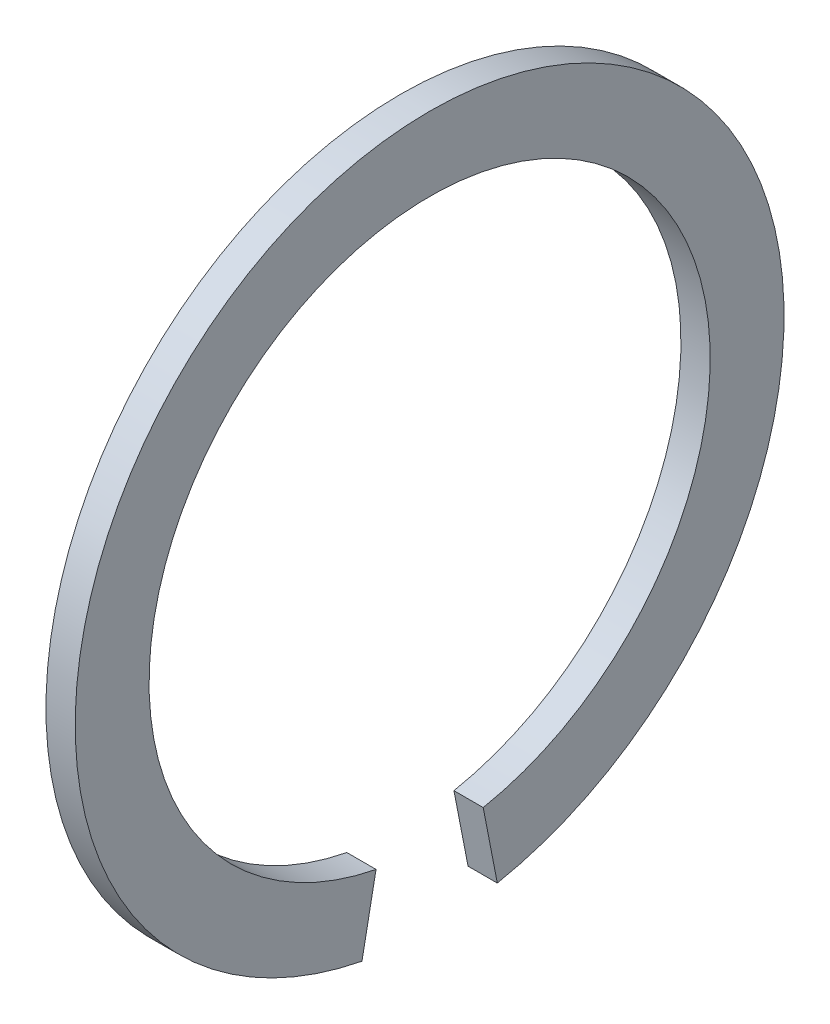
ISO-10303-21;
HEADER;
FILE_DESCRIPTION(('STEP AP214'),'2;1');
FILE_NAME('part.step','',(''),(''),'','','');
FILE_SCHEMA(('AUTOMOTIVE_DESIGN { 1 0 10303 214 1 1 1 1 }'));
ENDSEC;
DATA;
#1=APPLICATION_CONTEXT('core data for automotive mechanical design processes');
#2=APPLICATION_PROTOCOL_DEFINITION('international standard','automotive_design',2000,#1);
#3=PRODUCT_CONTEXT('',#1,'mechanical');
#4=PRODUCT('Part','Part','',(#3));
#5=PRODUCT_RELATED_PRODUCT_CATEGORY('part','',(#4));
#6=PRODUCT_DEFINITION_FORMATION('','',#4);
#7=PRODUCT_DEFINITION_CONTEXT('part definition',#1,'design');
#8=PRODUCT_DEFINITION('design','',#6,#7);
#9=PRODUCT_DEFINITION_SHAPE('','',#8);
#10=(LENGTH_UNIT() NAMED_UNIT(*) SI_UNIT(.MILLI.,.METRE.));
#11=(NAMED_UNIT(*) PLANE_ANGLE_UNIT() SI_UNIT($,.RADIAN.));
#12=(NAMED_UNIT(*) SI_UNIT($,.STERADIAN.) SOLID_ANGLE_UNIT());
#13=UNCERTAINTY_MEASURE_WITH_UNIT(LENGTH_MEASURE(1.E-05),#10,'distance_accuracy_value','');
#14=(GEOMETRIC_REPRESENTATION_CONTEXT(3) GLOBAL_UNCERTAINTY_ASSIGNED_CONTEXT((#13)) GLOBAL_UNIT_ASSIGNED_CONTEXT((#10,
#11,#12)) REPRESENTATION_CONTEXT('',''));
#15=CARTESIAN_POINT('',(0.,0.,0.));
#16=DIRECTION('',(0.,0.,1.));
#17=DIRECTION('',(1.,0.,0.));
#18=AXIS2_PLACEMENT_3D('',#15,#16,#17);
#19=CARTESIAN_POINT('',(1.09,0.,0.));
#20=DIRECTION('',(-1.,0.,0.));
#21=DIRECTION('',(0.,0.,1.));
#22=AXIS2_PLACEMENT_3D('',#19,#20,#21);
#23=CYLINDRICAL_SURFACE('',#22,13.2);
#24=CARTESIAN_POINT('',(0.,0.,0.));
#25=DIRECTION('',(1.,0.,0.));
#26=DIRECTION('',(0.,0.,-1.));
#27=AXIS2_PLACEMENT_3D('',#24,#25,#26);
#28=CIRCLE('',#27,13.2);
#29=CARTESIAN_POINT('',(0.,-12.9571299097505,-2.52047307104242));
#30=VERTEX_POINT('',#29);
#31=CARTESIAN_POINT('',(0.,-12.9571299097505,2.52047307104241));
#32=VERTEX_POINT('',#31);
#33=EDGE_CURVE('E99',#30,#32,#28,.T.);
#34=ORIENTED_EDGE('',*,*,#33,.T.);
#35=DIRECTION('',(-1.,0.,0.));
#36=VECTOR('',#35,1.);
#37=CARTESIAN_POINT('',(1.09,-12.9571299097505,2.52047307104241));
#38=LINE('',#37,#36);
#39=CARTESIAN_POINT('',(1.09,-12.9571299097505,2.52047307104241));
#40=VERTEX_POINT('',#39);
#41=EDGE_CURVE('E11',#40,#32,#38,.T.);
#42=ORIENTED_EDGE('',*,*,#41,.F.);
#43=CARTESIAN_POINT('',(1.09,0.,0.));
#44=DIRECTION('',(1.,0.,0.));
#45=DIRECTION('',(0.,0.,-1.));
#46=AXIS2_PLACEMENT_3D('',#43,#44,#45);
#47=CIRCLE('',#46,13.2);
#48=CARTESIAN_POINT('',(1.09,-12.9571299097505,-2.52047307104242));
#49=VERTEX_POINT('',#48);
#50=EDGE_CURVE('E87',#49,#40,#47,.T.);
#51=ORIENTED_EDGE('',*,*,#50,.F.);
#52=DIRECTION('',(-1.,0.,0.));
#53=VECTOR('',#52,1.);
#54=CARTESIAN_POINT('',(1.09,-12.9571299097505,-2.52047307104242));
#55=LINE('',#54,#53);
#56=EDGE_CURVE('E95',#49,#30,#55,.T.);
#57=ORIENTED_EDGE('',*,*,#56,.T.);
#58=EDGE_LOOP('',(#34,#42,#51,#57));
#59=FACE_BOUND('',#58,.T.);
#60=ADVANCED_FACE('F36',(#59),#23,.T.);
#61=CARTESIAN_POINT('',(1.09,-10.2577278452191,1.99537451457525));
#62=DIRECTION('',(0.,0.190944929624425,0.981600750738671));
#63=DIRECTION('',(0.,-0.981600750738671,0.190944929624425));
#64=AXIS2_PLACEMENT_3D('',#61,#62,#63);
#65=PLANE('',#64);
#66=DIRECTION('',(0.,0.981600750738671,-0.190944929624425));
#67=VECTOR('',#66,1.);
#68=CARTESIAN_POINT('',(0.,-10.2577278452191,1.99537451457525));
#69=LINE('',#68,#67);
#70=CARTESIAN_POINT('',(0.,-10.2577278452191,1.99537451457525));
#71=VERTEX_POINT('',#70);
#72=EDGE_CURVE('E91',#32,#71,#69,.T.);
#73=ORIENTED_EDGE('',*,*,#72,.T.);
#74=DIRECTION('',(-1.,0.,0.));
#75=VECTOR('',#74,1.);
#76=CARTESIAN_POINT('',(1.09,-10.2577278452191,1.99537451457525));
#77=LINE('',#76,#75);
#78=CARTESIAN_POINT('',(1.09,-10.2577278452191,1.99537451457525));
#79=VERTEX_POINT('',#78);
#80=EDGE_CURVE('E44',#79,#71,#77,.T.);
#81=ORIENTED_EDGE('',*,*,#80,.F.);
#82=DIRECTION('',(0.,0.981600750738671,-0.190944929624425));
#83=VECTOR('',#82,1.);
#84=CARTESIAN_POINT('',(1.09,-10.2577278452191,1.99537451457525));
#85=LINE('',#84,#83);
#86=EDGE_CURVE('E82',#40,#79,#85,.T.);
#87=ORIENTED_EDGE('',*,*,#86,.F.);
#88=ORIENTED_EDGE('',*,*,#41,.T.);
#89=EDGE_LOOP('',(#73,#81,#87,#88));
#90=FACE_BOUND('',#89,.T.);
#91=ADVANCED_FACE('F90',(#90),#65,.F.);
#92=CARTESIAN_POINT('',(1.09,0.,0.));
#93=DIRECTION('',(-1.,0.,0.));
#94=DIRECTION('',(0.,0.,1.));
#95=AXIS2_PLACEMENT_3D('',#92,#93,#94);
#96=CYLINDRICAL_SURFACE('',#95,10.45);
#97=CARTESIAN_POINT('',(0.,0.,0.));
#98=DIRECTION('',(-1.,0.,0.));
#99=DIRECTION('',(0.,0.,-1.));
#100=AXIS2_PLACEMENT_3D('',#97,#98,#99);
#101=CIRCLE('',#100,10.45);
#102=CARTESIAN_POINT('',(0.,-10.2577278452191,-1.99537451457524));
#103=VERTEX_POINT('',#102);
#104=EDGE_CURVE('E69',#71,#103,#101,.T.);
#105=ORIENTED_EDGE('',*,*,#104,.T.);
#106=DIRECTION('',(-1.,0.,0.));
#107=VECTOR('',#106,1.);
#108=CARTESIAN_POINT('',(1.09,-10.2577278452191,-1.99537451457524));
#109=LINE('',#108,#107);
#110=CARTESIAN_POINT('',(1.09,-10.2577278452191,-1.99537451457524));
#111=VERTEX_POINT('',#110);
#112=EDGE_CURVE('E92',#111,#103,#109,.T.);
#113=ORIENTED_EDGE('',*,*,#112,.F.);
#114=CARTESIAN_POINT('',(1.09,0.,0.));
#115=DIRECTION('',(-1.,0.,0.));
#116=DIRECTION('',(0.,0.,-1.));
#117=AXIS2_PLACEMENT_3D('',#114,#115,#116);
#118=CIRCLE('',#117,10.45);
#119=EDGE_CURVE('E85',#79,#111,#118,.T.);
#120=ORIENTED_EDGE('',*,*,#119,.F.);
#121=ORIENTED_EDGE('',*,*,#80,.T.);
#122=EDGE_LOOP('',(#105,#113,#120,#121));
#123=FACE_BOUND('',#122,.T.);
#124=ADVANCED_FACE('F93',(#123),#96,.F.);
#125=CARTESIAN_POINT('',(1.09,-10.2577278452191,-1.99537451457525));
#126=DIRECTION('',(0.,0.190944929624425,-0.981600750738671));
#127=DIRECTION('',(0.,0.981600750738671,0.190944929624425));
#128=AXIS2_PLACEMENT_3D('',#125,#126,#127);
#129=PLANE('',#128);
#130=DIRECTION('',(0.,-0.981600750738671,-0.190944929624425));
#131=VECTOR('',#130,1.);
#132=CARTESIAN_POINT('',(0.,-10.2577278452191,-1.99537451457525));
#133=LINE('',#132,#131);
#134=EDGE_CURVE('E75',#103,#30,#133,.T.);
#135=ORIENTED_EDGE('',*,*,#134,.T.);
#136=ORIENTED_EDGE('',*,*,#56,.F.);
#137=DIRECTION('',(0.,-0.981600750738671,-0.190944929624425));
#138=VECTOR('',#137,1.);
#139=CARTESIAN_POINT('',(1.09,-10.2577278452191,-1.99537451457525));
#140=LINE('',#139,#138);
#141=EDGE_CURVE('E52',#111,#49,#140,.T.);
#142=ORIENTED_EDGE('',*,*,#141,.F.);
#143=ORIENTED_EDGE('',*,*,#112,.T.);
#144=EDGE_LOOP('',(#135,#136,#142,#143));
#145=FACE_BOUND('',#144,.T.);
#146=ADVANCED_FACE('F106',(#145),#129,.F.);
#147=CARTESIAN_POINT('',(1.09,0.,0.));
#148=DIRECTION('',(1.,0.,0.));
#149=DIRECTION('',(0.,0.,-1.));
#150=AXIS2_PLACEMENT_3D('',#147,#148,#149);
#151=PLANE('',#150);
#152=ORIENTED_EDGE('',*,*,#50,.T.);
#153=ORIENTED_EDGE('',*,*,#86,.T.);
#154=ORIENTED_EDGE('',*,*,#119,.T.);
#155=ORIENTED_EDGE('',*,*,#141,.T.);
#156=EDGE_LOOP('',(#152,#153,#154,#155));
#157=FACE_BOUND('',#156,.T.);
#158=ADVANCED_FACE('F83',(#157),#151,.T.);
#159=CARTESIAN_POINT('',(0.,0.,0.));
#160=DIRECTION('',(1.,0.,0.));
#161=DIRECTION('',(0.,0.,-1.));
#162=AXIS2_PLACEMENT_3D('',#159,#160,#161);
#163=PLANE('',#162);
#164=ORIENTED_EDGE('',*,*,#33,.F.);
#165=ORIENTED_EDGE('',*,*,#134,.F.);
#166=ORIENTED_EDGE('',*,*,#104,.F.);
#167=ORIENTED_EDGE('',*,*,#72,.F.);
#168=EDGE_LOOP('',(#164,#165,#166,#167));
#169=FACE_BOUND('',#168,.T.);
#170=ADVANCED_FACE('F109',(#169),#163,.F.);
#171=CLOSED_SHELL('',(#60,#91,#124,#146,#158,#170));
#172=MANIFOLD_SOLID_BREP('B2',#171);
#173=ADVANCED_BREP_SHAPE_REPRESENTATION('',(#18,#172),#14);
#174=SHAPE_DEFINITION_REPRESENTATION(#9,#173);
ENDSEC;
END-ISO-10303-21;
